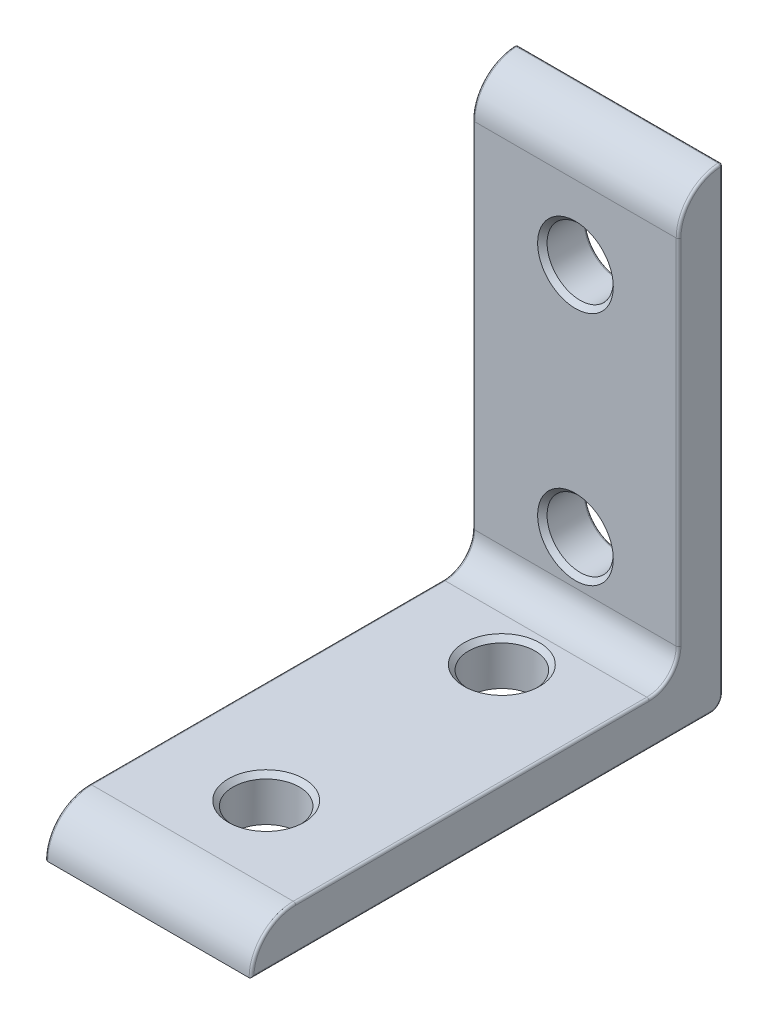
ISO-10303-21;
HEADER;
FILE_DESCRIPTION(('STEP AP214'),'2;1');
FILE_NAME('part.step','',(''),(''),'','','');
FILE_SCHEMA(('AUTOMOTIVE_DESIGN { 1 0 10303 214 1 1 1 1 }'));
ENDSEC;
DATA;
#1=APPLICATION_CONTEXT('core data for automotive mechanical design processes');
#2=APPLICATION_PROTOCOL_DEFINITION('international standard','automotive_design',2000,#1);
#3=PRODUCT_CONTEXT('',#1,'mechanical');
#4=PRODUCT('Part','Part','',(#3));
#5=PRODUCT_RELATED_PRODUCT_CATEGORY('part','',(#4));
#6=PRODUCT_DEFINITION_FORMATION('','',#4);
#7=PRODUCT_DEFINITION_CONTEXT('part definition',#1,'design');
#8=PRODUCT_DEFINITION('design','',#6,#7);
#9=PRODUCT_DEFINITION_SHAPE('','',#8);
#10=(LENGTH_UNIT() NAMED_UNIT(*) SI_UNIT(.MILLI.,.METRE.));
#11=(NAMED_UNIT(*) PLANE_ANGLE_UNIT() SI_UNIT($,.RADIAN.));
#12=(NAMED_UNIT(*) SI_UNIT($,.STERADIAN.) SOLID_ANGLE_UNIT());
#13=UNCERTAINTY_MEASURE_WITH_UNIT(LENGTH_MEASURE(1.E-05),#10,'distance_accuracy_value','');
#14=(GEOMETRIC_REPRESENTATION_CONTEXT(3) GLOBAL_UNCERTAINTY_ASSIGNED_CONTEXT((#13)) GLOBAL_UNIT_ASSIGNED_CONTEXT((#10,
#11,#12)) REPRESENTATION_CONTEXT('',''));
#15=CARTESIAN_POINT('',(0.,0.,0.));
#16=DIRECTION('',(0.,0.,1.));
#17=DIRECTION('',(1.,0.,0.));
#18=AXIS2_PLACEMENT_3D('',#15,#16,#17);
#19=CARTESIAN_POINT('',(-11.1125,-25.4,41.275));
#20=DIRECTION('',(1.,0.,0.));
#21=DIRECTION('',(0.,0.,-1.));
#22=AXIS2_PLACEMENT_3D('',#19,#20,#21);
#23=CYLINDRICAL_SURFACE('',#22,4.7625);
#24=DIRECTION('',(1.,0.,0.));
#25=VECTOR('',#24,1.);
#26=CARTESIAN_POINT('',(-11.1125,-20.6375,41.275));
#27=LINE('',#26,#25);
#28=CARTESIAN_POINT('',(-10.8585,-20.6375,41.275));
#29=VERTEX_POINT('',#28);
#30=CARTESIAN_POINT('',(10.8585,-20.6375,41.275));
#31=VERTEX_POINT('',#30);
#32=EDGE_CURVE('E230',#29,#31,#27,.T.);
#33=ORIENTED_EDGE('',*,*,#32,.F.);
#34=CARTESIAN_POINT('',(-10.8585,-25.4,41.275));
#35=DIRECTION('',(1.,0.,0.));
#36=DIRECTION('',(0.,0.,-1.));
#37=AXIS2_PLACEMENT_3D('',#34,#35,#36);
#38=CIRCLE('',#37,4.7625);
#39=CARTESIAN_POINT('',(-10.8585,-25.4,46.0375));
#40=VERTEX_POINT('',#39);
#41=EDGE_CURVE('E345',#29,#40,#38,.T.);
#42=ORIENTED_EDGE('',*,*,#41,.T.);
#43=DIRECTION('',(1.,0.,0.));
#44=VECTOR('',#43,1.);
#45=CARTESIAN_POINT('',(-11.1125,-25.4,46.0375));
#46=LINE('',#45,#44);
#47=CARTESIAN_POINT('',(10.8585,-25.4,46.0375));
#48=VERTEX_POINT('',#47);
#49=EDGE_CURVE('E220',#40,#48,#46,.T.);
#50=ORIENTED_EDGE('',*,*,#49,.T.);
#51=CARTESIAN_POINT('',(10.8585,-25.4,41.275));
#52=DIRECTION('',(1.,0.,0.));
#53=DIRECTION('',(0.,0.,-1.));
#54=AXIS2_PLACEMENT_3D('',#51,#52,#53);
#55=CIRCLE('',#54,4.7625);
#56=EDGE_CURVE('E342',#48,#31,#55,.F.);
#57=ORIENTED_EDGE('',*,*,#56,.T.);
#58=EDGE_LOOP('',(#33,#42,#50,#57));
#59=FACE_BOUND('',#58,.T.);
#60=ADVANCED_FACE('F47',(#59),#23,.T.);
#61=CARTESIAN_POINT('',(-11.1125,-20.6375,3.17499999999999));
#62=DIRECTION('',(0.,1.,0.));
#63=DIRECTION('',(0.,0.,1.));
#64=AXIS2_PLACEMENT_3D('',#61,#62,#63);
#65=PLANE('',#64);
#66=CARTESIAN_POINT('',(0.,-20.6375,33.3375));
#67=DIRECTION('',(0.,1.,0.));
#68=DIRECTION('',(0.,0.,1.));
#69=AXIS2_PLACEMENT_3D('',#66,#67,#68);
#70=CIRCLE('',#69,4.07670000000001);
#71=CARTESIAN_POINT('',(0.,-20.6375,37.4142));
#72=VERTEX_POINT('',#71);
#73=EDGE_CURVE('E276',#72,#72,#70,.F.);
#74=ORIENTED_EDGE('',*,*,#73,.T.);
#75=EDGE_LOOP('',(#74));
#76=FACE_BOUND('',#75,.T.);
#77=CARTESIAN_POINT('',(0.,-20.6375,7.9375));
#78=DIRECTION('',(0.,1.,0.));
#79=DIRECTION('',(0.,0.,1.));
#80=AXIS2_PLACEMENT_3D('',#77,#78,#79);
#81=CIRCLE('',#80,4.07670000000001);
#82=CARTESIAN_POINT('',(0.,-20.6375,12.0142));
#83=VERTEX_POINT('',#82);
#84=EDGE_CURVE('E272',#83,#83,#81,.F.);
#85=ORIENTED_EDGE('',*,*,#84,.T.);
#86=EDGE_LOOP('',(#85));
#87=FACE_BOUND('',#86,.T.);
#88=DIRECTION('',(1.,0.,0.));
#89=VECTOR('',#88,1.);
#90=CARTESIAN_POINT('',(-11.1125,-20.6375,3.17499999999999));
#91=LINE('',#90,#89);
#92=CARTESIAN_POINT('',(-10.8585,-20.6375,3.17499999999999));
#93=VERTEX_POINT('',#92);
#94=CARTESIAN_POINT('',(10.8585,-20.6375,3.17499999999999));
#95=VERTEX_POINT('',#94);
#96=EDGE_CURVE('E240',#93,#95,#91,.T.);
#97=ORIENTED_EDGE('',*,*,#96,.F.);
#98=DIRECTION('',(0.,0.,1.));
#99=VECTOR('',#98,1.);
#100=CARTESIAN_POINT('',(-10.8585,-20.6375,41.275));
#101=LINE('',#100,#99);
#102=EDGE_CURVE('E351',#93,#29,#101,.T.);
#103=ORIENTED_EDGE('',*,*,#102,.T.);
#104=ORIENTED_EDGE('',*,*,#32,.T.);
#105=DIRECTION('',(0.,0.,1.));
#106=VECTOR('',#105,1.);
#107=CARTESIAN_POINT('',(10.8585,-20.6375,3.17499999999999));
#108=LINE('',#107,#106);
#109=EDGE_CURVE('E348',#31,#95,#108,.F.);
#110=ORIENTED_EDGE('',*,*,#109,.T.);
#111=EDGE_LOOP('',(#97,#103,#104,#110));
#112=FACE_BOUND('',#111,.T.);
#113=ADVANCED_FACE('F636',(#76,#87,#112),#65,.T.);
#114=CARTESIAN_POINT('',(-11.1125,-17.4625,3.17499999999999));
#115=DIRECTION('',(1.,0.,0.));
#116=DIRECTION('',(0.,0.,-1.));
#117=AXIS2_PLACEMENT_3D('',#114,#115,#116);
#118=CYLINDRICAL_SURFACE('',#117,3.175);
#119=DIRECTION('',(1.,0.,0.));
#120=VECTOR('',#119,1.);
#121=CARTESIAN_POINT('',(-11.1125,-17.4625,0.));
#122=LINE('',#121,#120);
#123=CARTESIAN_POINT('',(-10.8585,-17.4625,0.));
#124=VERTEX_POINT('',#123);
#125=CARTESIAN_POINT('',(10.8585,-17.4625,0.));
#126=VERTEX_POINT('',#125);
#127=EDGE_CURVE('E606',#124,#126,#122,.T.);
#128=ORIENTED_EDGE('',*,*,#127,.F.);
#129=CARTESIAN_POINT('',(-10.8585,-17.4625,3.17499999999999));
#130=DIRECTION('',(1.,0.,0.));
#131=DIRECTION('',(0.,0.,-1.));
#132=AXIS2_PLACEMENT_3D('',#129,#130,#131);
#133=CIRCLE('',#132,3.175);
#134=EDGE_CURVE('E357',#124,#93,#133,.F.);
#135=ORIENTED_EDGE('',*,*,#134,.T.);
#136=ORIENTED_EDGE('',*,*,#96,.T.);
#137=CARTESIAN_POINT('',(10.8585,-17.4625,3.17499999999999));
#138=DIRECTION('',(1.,0.,0.));
#139=DIRECTION('',(0.,0.,-1.));
#140=AXIS2_PLACEMENT_3D('',#137,#138,#139);
#141=CIRCLE('',#140,3.175);
#142=EDGE_CURVE('E354',#95,#126,#141,.T.);
#143=ORIENTED_EDGE('',*,*,#142,.T.);
#144=EDGE_LOOP('',(#128,#135,#136,#143));
#145=FACE_BOUND('',#144,.T.);
#146=ADVANCED_FACE('F640',(#145),#118,.F.);
#147=CARTESIAN_POINT('',(-11.1125,20.6375,0.));
#148=DIRECTION('',(0.,0.,1.));
#149=DIRECTION('',(0.,-1.,0.));
#150=AXIS2_PLACEMENT_3D('',#147,#148,#149);
#151=PLANE('',#150);
#152=CARTESIAN_POINT('',(0.,12.7,0.));
#153=DIRECTION('',(0.,0.,1.));
#154=DIRECTION('',(0.,-1.,0.));
#155=AXIS2_PLACEMENT_3D('',#152,#153,#154);
#156=CIRCLE('',#155,4.0767);
#157=CARTESIAN_POINT('',(0.,8.6233,0.));
#158=VERTEX_POINT('',#157);
#159=EDGE_CURVE('E260',#158,#158,#156,.F.);
#160=ORIENTED_EDGE('',*,*,#159,.T.);
#161=EDGE_LOOP('',(#160));
#162=FACE_BOUND('',#161,.T.);
#163=CARTESIAN_POINT('',(0.,-12.7,0.));
#164=DIRECTION('',(0.,0.,1.));
#165=DIRECTION('',(0.,-1.,0.));
#166=AXIS2_PLACEMENT_3D('',#163,#164,#165);
#167=CIRCLE('',#166,4.07670000000001);
#168=CARTESIAN_POINT('',(0.,-16.7767,0.));
#169=VERTEX_POINT('',#168);
#170=EDGE_CURVE('E256',#169,#169,#167,.F.);
#171=ORIENTED_EDGE('',*,*,#170,.T.);
#172=EDGE_LOOP('',(#171));
#173=FACE_BOUND('',#172,.T.);
#174=DIRECTION('',(1.,0.,0.));
#175=VECTOR('',#174,1.);
#176=CARTESIAN_POINT('',(-11.1125,20.6375,0.));
#177=LINE('',#176,#175);
#178=CARTESIAN_POINT('',(-10.8585,20.6375,0.));
#179=VERTEX_POINT('',#178);
#180=CARTESIAN_POINT('',(10.8585,20.6375,0.));
#181=VERTEX_POINT('',#180);
#182=EDGE_CURVE('E611',#179,#181,#177,.T.);
#183=ORIENTED_EDGE('',*,*,#182,.F.);
#184=DIRECTION('',(0.,-1.,0.));
#185=VECTOR('',#184,1.);
#186=CARTESIAN_POINT('',(-10.8585,-17.4625,0.));
#187=LINE('',#186,#185);
#188=EDGE_CURVE('E11',#179,#124,#187,.T.);
#189=ORIENTED_EDGE('',*,*,#188,.T.);
#190=ORIENTED_EDGE('',*,*,#127,.T.);
#191=DIRECTION('',(0.,-1.,0.));
#192=VECTOR('',#191,1.);
#193=CARTESIAN_POINT('',(10.8585,20.6375,0.));
#194=LINE('',#193,#192);
#195=EDGE_CURVE('E57',#126,#181,#194,.F.);
#196=ORIENTED_EDGE('',*,*,#195,.T.);
#197=EDGE_LOOP('',(#183,#189,#190,#196));
#198=FACE_BOUND('',#197,.T.);
#199=ADVANCED_FACE('F670',(#162,#173,#198),#151,.T.);
#200=CARTESIAN_POINT('',(-11.1125,20.6375,-4.7625));
#201=DIRECTION('',(1.,0.,0.));
#202=DIRECTION('',(0.,0.,-1.));
#203=AXIS2_PLACEMENT_3D('',#200,#201,#202);
#204=CYLINDRICAL_SURFACE('',#203,4.7625);
#205=DIRECTION('',(1.,0.,0.));
#206=VECTOR('',#205,1.);
#207=CARTESIAN_POINT('',(-11.1125,25.39243596902,-4.49419014084507));
#208=LINE('',#207,#206);
#209=CARTESIAN_POINT('',(10.8585,25.39243596902,-4.49419014084507));
#210=VERTEX_POINT('',#209);
#211=CARTESIAN_POINT('',(-10.8585,25.39243596902,-4.49419014084507));
#212=VERTEX_POINT('',#211);
#213=EDGE_CURVE('E333',#210,#212,#208,.F.);
#214=ORIENTED_EDGE('',*,*,#213,.T.);
#215=CARTESIAN_POINT('',(-10.8585,20.6375,-4.7625));
#216=DIRECTION('',(1.,0.,0.));
#217=DIRECTION('',(0.,0.,-1.));
#218=AXIS2_PLACEMENT_3D('',#215,#216,#217);
#219=CIRCLE('',#218,4.7625);
#220=EDGE_CURVE('E339',#212,#179,#219,.T.);
#221=ORIENTED_EDGE('',*,*,#220,.T.);
#222=ORIENTED_EDGE('',*,*,#182,.T.);
#223=CARTESIAN_POINT('',(10.8585,20.6375,-4.7625));
#224=DIRECTION('',(1.,0.,0.));
#225=DIRECTION('',(0.,0.,-1.));
#226=AXIS2_PLACEMENT_3D('',#223,#224,#225);
#227=CIRCLE('',#226,4.7625);
#228=EDGE_CURVE('E336',#181,#210,#227,.F.);
#229=ORIENTED_EDGE('',*,*,#228,.T.);
#230=EDGE_LOOP('',(#214,#221,#222,#229));
#231=FACE_BOUND('',#230,.T.);
#232=ADVANCED_FACE('F660',(#231),#204,.T.);
#233=CARTESIAN_POINT('',(-11.1125,-25.4,-4.7625));
#234=DIRECTION('',(0.,0.,-1.));
#235=DIRECTION('',(0.,1.,0.));
#236=AXIS2_PLACEMENT_3D('',#233,#234,#235);
#237=PLANE('',#236);
#238=CARTESIAN_POINT('',(0.,-12.7,-4.7625));
#239=DIRECTION('',(0.,0.,-1.));
#240=DIRECTION('',(0.,1.,0.));
#241=AXIS2_PLACEMENT_3D('',#238,#239,#240);
#242=CIRCLE('',#241,3.8227);
#243=CARTESIAN_POINT('',(0.,-8.8773,-4.7625));
#244=VERTEX_POINT('',#243);
#245=EDGE_CURVE('E364',#244,#244,#242,.F.);
#246=ORIENTED_EDGE('',*,*,#245,.T.);
#247=EDGE_LOOP('',(#246));
#248=FACE_BOUND('',#247,.T.);
#249=CARTESIAN_POINT('',(0.,12.7,-4.7625));
#250=DIRECTION('',(0.,0.,-1.));
#251=DIRECTION('',(0.,1.,0.));
#252=AXIS2_PLACEMENT_3D('',#249,#250,#251);
#253=CIRCLE('',#252,3.8227);
#254=CARTESIAN_POINT('',(0.,16.5227,-4.7625));
#255=VERTEX_POINT('',#254);
#256=EDGE_CURVE('E360',#255,#255,#253,.F.);
#257=ORIENTED_EDGE('',*,*,#256,.T.);
#258=EDGE_LOOP('',(#257));
#259=FACE_BOUND('',#258,.T.);
#260=DIRECTION('',(1.,0.,0.));
#261=VECTOR('',#260,1.);
#262=CARTESIAN_POINT('',(-11.1125,-24.1284125,-4.7625));
#263=LINE('',#262,#261);
#264=CARTESIAN_POINT('',(10.8585,-24.1284125,-4.7625));
#265=VERTEX_POINT('',#264);
#266=CARTESIAN_POINT('',(-10.8585,-24.1284125,-4.7625));
#267=VERTEX_POINT('',#266);
#268=EDGE_CURVE('E229',#265,#267,#263,.F.);
#269=ORIENTED_EDGE('',*,*,#268,.T.);
#270=DIRECTION('',(0.,1.,0.));
#271=VECTOR('',#270,1.);
#272=CARTESIAN_POINT('',(-10.8585,25.4,-4.7625));
#273=LINE('',#272,#271);
#274=CARTESIAN_POINT('',(-10.8585,25.1388393840056,-4.7625));
#275=VERTEX_POINT('',#274);
#276=EDGE_CURVE('E68',#267,#275,#273,.T.);
#277=ORIENTED_EDGE('',*,*,#276,.T.);
#278=DIRECTION('',(1.,0.,0.));
#279=VECTOR('',#278,1.);
#280=CARTESIAN_POINT('',(-11.1125,25.1388393840056,-4.7625));
#281=LINE('',#280,#279);
#282=CARTESIAN_POINT('',(10.8585,25.1388393840056,-4.7625));
#283=VERTEX_POINT('',#282);
#284=EDGE_CURVE('E72',#275,#283,#281,.T.);
#285=ORIENTED_EDGE('',*,*,#284,.T.);
#286=DIRECTION('',(0.,1.,0.));
#287=VECTOR('',#286,1.);
#288=CARTESIAN_POINT('',(10.8585,-25.4,-4.7625));
#289=LINE('',#288,#287);
#290=EDGE_CURVE('E368',#283,#265,#289,.F.);
#291=ORIENTED_EDGE('',*,*,#290,.T.);
#292=EDGE_LOOP('',(#269,#277,#285,#291));
#293=FACE_BOUND('',#292,.T.);
#294=ADVANCED_FACE('F658',(#248,#259,#293),#237,.T.);
#295=CARTESIAN_POINT('',(-11.1125,-25.4,46.0375));
#296=DIRECTION('',(0.,-1.,0.));
#297=DIRECTION('',(0.,0.,-1.));
#298=AXIS2_PLACEMENT_3D('',#295,#296,#297);
#299=PLANE('',#298);
#300=CARTESIAN_POINT('',(0.,-25.4,7.9375));
#301=DIRECTION('',(0.,-1.,0.));
#302=DIRECTION('',(0.,0.,-1.));
#303=AXIS2_PLACEMENT_3D('',#300,#301,#302);
#304=CIRCLE('',#303,3.5687);
#305=CARTESIAN_POINT('',(0.,-25.4,4.3688));
#306=VERTEX_POINT('',#305);
#307=EDGE_CURVE('E249',#306,#306,#304,.T.);
#308=ORIENTED_EDGE('',*,*,#307,.F.);
#309=EDGE_LOOP('',(#308));
#310=FACE_BOUND('',#309,.T.);
#311=CARTESIAN_POINT('',(0.,-25.4,33.3375));
#312=DIRECTION('',(0.,-1.,0.));
#313=DIRECTION('',(0.,0.,-1.));
#314=AXIS2_PLACEMENT_3D('',#311,#312,#313);
#315=CIRCLE('',#314,3.5687);
#316=CARTESIAN_POINT('',(0.,-25.4,29.7688));
#317=VERTEX_POINT('',#316);
#318=EDGE_CURVE('E245',#317,#317,#315,.T.);
#319=ORIENTED_EDGE('',*,*,#318,.F.);
#320=EDGE_LOOP('',(#319));
#321=FACE_BOUND('',#320,.T.);
#322=ORIENTED_EDGE('',*,*,#49,.F.);
#323=DIRECTION('',(0.,0.,-1.));
#324=VECTOR('',#323,1.);
#325=CARTESIAN_POINT('',(-10.8585,-25.4,-3.4909125));
#326=LINE('',#325,#324);
#327=CARTESIAN_POINT('',(-10.8585,-25.4,-3.4909125));
#328=VERTEX_POINT('',#327);
#329=EDGE_CURVE('E193',#40,#328,#326,.T.);
#330=ORIENTED_EDGE('',*,*,#329,.T.);
#331=DIRECTION('',(1.,0.,0.));
#332=VECTOR('',#331,1.);
#333=CARTESIAN_POINT('',(-11.1125,-25.4,-3.4909125));
#334=LINE('',#333,#332);
#335=CARTESIAN_POINT('',(10.8585,-25.4,-3.4909125));
#336=VERTEX_POINT('',#335);
#337=EDGE_CURVE('E217',#328,#336,#334,.T.);
#338=ORIENTED_EDGE('',*,*,#337,.T.);
#339=DIRECTION('',(0.,0.,-1.));
#340=VECTOR('',#339,1.);
#341=CARTESIAN_POINT('',(10.8585,-25.4,46.0375));
#342=LINE('',#341,#340);
#343=EDGE_CURVE('E224',#336,#48,#342,.F.);
#344=ORIENTED_EDGE('',*,*,#343,.T.);
#345=EDGE_LOOP('',(#322,#330,#338,#344));
#346=FACE_BOUND('',#345,.T.);
#347=ADVANCED_FACE('F216',(#310,#321,#346),#299,.T.);
#348=CARTESIAN_POINT('',(-11.1125,-25.4,41.275));
#349=DIRECTION('',(1.,0.,0.));
#350=DIRECTION('',(0.,0.,-1.));
#351=AXIS2_PLACEMENT_3D('',#348,#349,#350);
#352=PLANE('',#351);
#353=DIRECTION('',(0.,1.,0.));
#354=VECTOR('',#353,1.);
#355=CARTESIAN_POINT('',(-11.1125,-24.1284125,-4.5085));
#356=LINE('',#355,#354);
#357=CARTESIAN_POINT('',(-11.1125,25.1388393840056,-4.5085));
#358=VERTEX_POINT('',#357);
#359=CARTESIAN_POINT('',(-11.1125,-24.1284125,-4.5085));
#360=VERTEX_POINT('',#359);
#361=EDGE_CURVE('E302',#358,#360,#356,.F.);
#362=ORIENTED_EDGE('',*,*,#361,.T.);
#363=CARTESIAN_POINT('',(-11.1125,-24.1284125,-3.4909125));
#364=DIRECTION('',(1.,0.,0.));
#365=DIRECTION('',(0.,0.,-1.));
#366=AXIS2_PLACEMENT_3D('',#363,#364,#365);
#367=CIRCLE('',#366,1.0175875);
#368=CARTESIAN_POINT('',(-11.1125,-25.146,-3.4909125));
#369=VERTEX_POINT('',#368);
#370=EDGE_CURVE('E305',#360,#369,#367,.F.);
#371=ORIENTED_EDGE('',*,*,#370,.T.);
#372=DIRECTION('',(0.,0.,-1.));
#373=VECTOR('',#372,1.);
#374=CARTESIAN_POINT('',(-11.1125,-25.146,46.0375));
#375=LINE('',#374,#373);
#376=CARTESIAN_POINT('',(-11.1125,-25.146,45.7763393840056));
#377=VERTEX_POINT('',#376);
#378=EDGE_CURVE('E195',#369,#377,#375,.F.);
#379=ORIENTED_EDGE('',*,*,#378,.T.);
#380=CARTESIAN_POINT('',(-11.1125,-25.4,41.275));
#381=DIRECTION('',(1.,0.,0.));
#382=DIRECTION('',(0.,0.,-1.));
#383=AXIS2_PLACEMENT_3D('',#380,#381,#382);
#384=CIRCLE('',#383,4.5085);
#385=CARTESIAN_POINT('',(-11.1125,-20.8915,41.275));
#386=VERTEX_POINT('',#385);
#387=EDGE_CURVE('E294',#377,#386,#384,.F.);
#388=ORIENTED_EDGE('',*,*,#387,.T.);
#389=DIRECTION('',(0.,0.,1.));
#390=VECTOR('',#389,1.);
#391=CARTESIAN_POINT('',(-11.1125,-20.8915,3.17499999999999));
#392=LINE('',#391,#390);
#393=CARTESIAN_POINT('',(-11.1125,-20.8915,3.17499999999999));
#394=VERTEX_POINT('',#393);
#395=EDGE_CURVE('E291',#386,#394,#392,.F.);
#396=ORIENTED_EDGE('',*,*,#395,.T.);
#397=CARTESIAN_POINT('',(-11.1125,-17.4625,3.17499999999999));
#398=DIRECTION('',(1.,0.,0.));
#399=DIRECTION('',(0.,0.,-1.));
#400=AXIS2_PLACEMENT_3D('',#397,#398,#399);
#401=CIRCLE('',#400,3.429);
#402=CARTESIAN_POINT('',(-11.1125,-17.4625,-0.254000000000005));
#403=VERTEX_POINT('',#402);
#404=EDGE_CURVE('E288',#394,#403,#401,.T.);
#405=ORIENTED_EDGE('',*,*,#404,.T.);
#406=DIRECTION('',(0.,-1.,0.));
#407=VECTOR('',#406,1.);
#408=CARTESIAN_POINT('',(-11.1125,20.6375,-0.254000000000002));
#409=LINE('',#408,#407);
#410=CARTESIAN_POINT('',(-11.1125,20.6375,-0.254000000000002));
#411=VERTEX_POINT('',#410);
#412=EDGE_CURVE('E223',#403,#411,#409,.F.);
#413=ORIENTED_EDGE('',*,*,#412,.T.);
#414=CARTESIAN_POINT('',(-11.1125,20.6375,-4.7625));
#415=DIRECTION('',(1.,0.,0.));
#416=DIRECTION('',(0.,0.,-1.));
#417=AXIS2_PLACEMENT_3D('',#414,#415,#416);
#418=CIRCLE('',#417,4.5085);
#419=EDGE_CURVE('E297',#411,#358,#418,.F.);
#420=ORIENTED_EDGE('',*,*,#419,.T.);
#421=EDGE_LOOP('',(#362,#371,#379,#388,#396,#405,#413,#420));
#422=FACE_BOUND('',#421,.T.);
#423=ADVANCED_FACE('F647',(#422),#352,.F.);
#424=CARTESIAN_POINT('',(11.1125,-25.4,41.275));
#425=DIRECTION('',(1.,0.,0.));
#426=DIRECTION('',(0.,0.,-1.));
#427=AXIS2_PLACEMENT_3D('',#424,#425,#426);
#428=PLANE('',#427);
#429=DIRECTION('',(0.,0.,-1.));
#430=VECTOR('',#429,1.);
#431=CARTESIAN_POINT('',(11.1125,-25.146,41.275));
#432=LINE('',#431,#430);
#433=CARTESIAN_POINT('',(11.1125,-25.146,45.7763393840056));
#434=VERTEX_POINT('',#433);
#435=CARTESIAN_POINT('',(11.1125,-25.146,-3.4909125));
#436=VERTEX_POINT('',#435);
#437=EDGE_CURVE('E324',#434,#436,#432,.T.);
#438=ORIENTED_EDGE('',*,*,#437,.T.);
#439=CARTESIAN_POINT('',(11.1125,-24.1284125,-3.4909125));
#440=DIRECTION('',(1.,0.,0.));
#441=DIRECTION('',(0.,0.,-1.));
#442=AXIS2_PLACEMENT_3D('',#439,#440,#441);
#443=CIRCLE('',#442,1.0175875);
#444=CARTESIAN_POINT('',(11.1125,-24.1284125,-4.5085));
#445=VERTEX_POINT('',#444);
#446=EDGE_CURVE('E330',#436,#445,#443,.T.);
#447=ORIENTED_EDGE('',*,*,#446,.T.);
#448=DIRECTION('',(0.,1.,0.));
#449=VECTOR('',#448,1.);
#450=CARTESIAN_POINT('',(11.1125,-25.4,-4.5085));
#451=LINE('',#450,#449);
#452=CARTESIAN_POINT('',(11.1125,25.1388393840056,-4.5085));
#453=VERTEX_POINT('',#452);
#454=EDGE_CURVE('E327',#445,#453,#451,.T.);
#455=ORIENTED_EDGE('',*,*,#454,.T.);
#456=CARTESIAN_POINT('',(11.1125,20.6375,-4.7625));
#457=DIRECTION('',(1.,0.,0.));
#458=DIRECTION('',(0.,0.,-1.));
#459=AXIS2_PLACEMENT_3D('',#456,#457,#458);
#460=CIRCLE('',#459,4.5085);
#461=CARTESIAN_POINT('',(11.1125,20.6375,-0.254000000000007));
#462=VERTEX_POINT('',#461);
#463=EDGE_CURVE('E321',#453,#462,#460,.T.);
#464=ORIENTED_EDGE('',*,*,#463,.T.);
#465=DIRECTION('',(0.,-1.,0.));
#466=VECTOR('',#465,1.);
#467=CARTESIAN_POINT('',(11.1125,-25.4,-0.254000000000011));
#468=LINE('',#467,#466);
#469=CARTESIAN_POINT('',(11.1125,-17.4625,-0.25400000000001));
#470=VERTEX_POINT('',#469);
#471=EDGE_CURVE('E210',#462,#470,#468,.T.);
#472=ORIENTED_EDGE('',*,*,#471,.T.);
#473=CARTESIAN_POINT('',(11.1125,-17.4625,3.17499999999999));
#474=DIRECTION('',(1.,0.,0.));
#475=DIRECTION('',(0.,0.,-1.));
#476=AXIS2_PLACEMENT_3D('',#473,#474,#475);
#477=CIRCLE('',#476,3.429);
#478=CARTESIAN_POINT('',(11.1125,-20.8915,3.17499999999999));
#479=VERTEX_POINT('',#478);
#480=EDGE_CURVE('E312',#470,#479,#477,.F.);
#481=ORIENTED_EDGE('',*,*,#480,.T.);
#482=DIRECTION('',(0.,0.,1.));
#483=VECTOR('',#482,1.);
#484=CARTESIAN_POINT('',(11.1125,-20.8915,41.275));
#485=LINE('',#484,#483);
#486=CARTESIAN_POINT('',(11.1125,-20.8915,41.275));
#487=VERTEX_POINT('',#486);
#488=EDGE_CURVE('E315',#479,#487,#485,.T.);
#489=ORIENTED_EDGE('',*,*,#488,.T.);
#490=CARTESIAN_POINT('',(11.1125,-25.4,41.275));
#491=DIRECTION('',(1.,0.,0.));
#492=DIRECTION('',(0.,0.,-1.));
#493=AXIS2_PLACEMENT_3D('',#490,#491,#492);
#494=CIRCLE('',#493,4.5085);
#495=EDGE_CURVE('E318',#487,#434,#494,.T.);
#496=ORIENTED_EDGE('',*,*,#495,.T.);
#497=EDGE_LOOP('',(#438,#447,#455,#464,#472,#481,#489,#496));
#498=FACE_BOUND('',#497,.T.);
#499=ADVANCED_FACE('F628',(#498),#428,.T.);
#500=CARTESIAN_POINT('',(-11.1125,-24.1284125,-3.4909125));
#501=DIRECTION('',(1.,0.,0.));
#502=DIRECTION('',(0.,0.,-1.));
#503=AXIS2_PLACEMENT_3D('',#500,#501,#502);
#504=CYLINDRICAL_SURFACE('',#503,1.2715875);
#505=ORIENTED_EDGE('',*,*,#337,.F.);
#506=CARTESIAN_POINT('',(-10.8585,-24.1284125,-3.4909125));
#507=DIRECTION('',(1.,0.,0.));
#508=DIRECTION('',(0.,0.,-1.));
#509=AXIS2_PLACEMENT_3D('',#506,#507,#508);
#510=CIRCLE('',#509,1.2715875);
#511=EDGE_CURVE('E202',#328,#267,#510,.T.);
#512=ORIENTED_EDGE('',*,*,#511,.T.);
#513=ORIENTED_EDGE('',*,*,#268,.F.);
#514=CARTESIAN_POINT('',(10.8585,-24.1284125,-3.4909125));
#515=DIRECTION('',(1.,0.,0.));
#516=DIRECTION('',(0.,0.,-1.));
#517=AXIS2_PLACEMENT_3D('',#514,#515,#516);
#518=CIRCLE('',#517,1.2715875);
#519=EDGE_CURVE('E211',#265,#336,#518,.F.);
#520=ORIENTED_EDGE('',*,*,#519,.T.);
#521=EDGE_LOOP('',(#505,#512,#513,#520));
#522=FACE_BOUND('',#521,.T.);
#523=ADVANCED_FACE('F226',(#522),#504,.T.);
#524=CARTESIAN_POINT('',(0.,-12.7,-4.7625));
#525=DIRECTION('',(0.,0.,1.));
#526=DIRECTION('',(1.,0.,0.));
#527=AXIS2_PLACEMENT_3D('',#524,#525,#526);
#528=CYLINDRICAL_SURFACE('',#527,3.5687);
#529=CARTESIAN_POINT('',(0.,-12.7,-4.5085));
#530=DIRECTION('',(0.,0.,-1.));
#531=DIRECTION('',(0.,1.,0.));
#532=AXIS2_PLACEMENT_3D('',#529,#530,#531);
#533=CIRCLE('',#532,3.5687);
#534=CARTESIAN_POINT('',(0.,-9.1313,-4.5085));
#535=VERTEX_POINT('',#534);
#536=EDGE_CURVE('E375',#535,#535,#533,.T.);
#537=ORIENTED_EDGE('',*,*,#536,.T.);
#538=EDGE_LOOP('',(#537));
#539=FACE_BOUND('',#538,.T.);
#540=CARTESIAN_POINT('',(0.,-12.7,-0.508000000000005));
#541=DIRECTION('',(0.,0.,1.));
#542=DIRECTION('',(1.,0.,0.));
#543=AXIS2_PLACEMENT_3D('',#540,#541,#542);
#544=CIRCLE('',#543,3.5687);
#545=CARTESIAN_POINT('',(3.5687,-12.7,-0.508000000000005));
#546=VERTEX_POINT('',#545);
#547=EDGE_CURVE('E264',#546,#546,#544,.T.);
#548=ORIENTED_EDGE('',*,*,#547,.T.);
#549=EDGE_LOOP('',(#548));
#550=FACE_BOUND('',#549,.T.);
#551=ADVANCED_FACE('F686',(#539,#550),#528,.F.);
#552=CARTESIAN_POINT('',(0.,12.7,-4.7625));
#553=DIRECTION('',(0.,0.,1.));
#554=DIRECTION('',(1.,0.,0.));
#555=AXIS2_PLACEMENT_3D('',#552,#553,#554);
#556=CYLINDRICAL_SURFACE('',#555,3.5687);
#557=CARTESIAN_POINT('',(0.,12.7,-4.5085));
#558=DIRECTION('',(0.,0.,-1.));
#559=DIRECTION('',(0.,1.,0.));
#560=AXIS2_PLACEMENT_3D('',#557,#558,#559);
#561=CIRCLE('',#560,3.5687);
#562=CARTESIAN_POINT('',(0.,16.2687,-4.5085));
#563=VERTEX_POINT('',#562);
#564=EDGE_CURVE('E379',#563,#563,#561,.T.);
#565=ORIENTED_EDGE('',*,*,#564,.T.);
#566=EDGE_LOOP('',(#565));
#567=FACE_BOUND('',#566,.T.);
#568=CARTESIAN_POINT('',(0.,12.7,-0.508000000000002));
#569=DIRECTION('',(0.,0.,1.));
#570=DIRECTION('',(1.,0.,0.));
#571=AXIS2_PLACEMENT_3D('',#568,#569,#570);
#572=CIRCLE('',#571,3.5687);
#573=CARTESIAN_POINT('',(3.5687,12.7,-0.508000000000002));
#574=VERTEX_POINT('',#573);
#575=EDGE_CURVE('E236',#574,#574,#572,.T.);
#576=ORIENTED_EDGE('',*,*,#575,.T.);
#577=EDGE_LOOP('',(#576));
#578=FACE_BOUND('',#577,.T.);
#579=ADVANCED_FACE('F715',(#567,#578),#556,.F.);
#580=CARTESIAN_POINT('',(0.,-28.5115,33.3375));
#581=DIRECTION('',(0.,1.,0.));
#582=DIRECTION('',(0.,0.,1.));
#583=AXIS2_PLACEMENT_3D('',#580,#581,#582);
#584=CYLINDRICAL_SURFACE('',#583,3.5687);
#585=CARTESIAN_POINT('',(0.,-21.1455,33.3375));
#586=DIRECTION('',(0.,1.,0.));
#587=DIRECTION('',(0.,0.,1.));
#588=AXIS2_PLACEMENT_3D('',#585,#586,#587);
#589=CIRCLE('',#588,3.5687);
#590=CARTESIAN_POINT('',(0.,-21.1455,36.9062));
#591=VERTEX_POINT('',#590);
#592=EDGE_CURVE('E268',#591,#591,#589,.T.);
#593=ORIENTED_EDGE('',*,*,#592,.T.);
#594=EDGE_LOOP('',(#593));
#595=FACE_BOUND('',#594,.T.);
#596=ORIENTED_EDGE('',*,*,#318,.T.);
#597=EDGE_LOOP('',(#596));
#598=FACE_BOUND('',#597,.T.);
#599=ADVANCED_FACE('F708',(#595,#598),#584,.F.);
#600=CARTESIAN_POINT('',(0.,-28.5115,7.9375));
#601=DIRECTION('',(0.,1.,0.));
#602=DIRECTION('',(0.,0.,1.));
#603=AXIS2_PLACEMENT_3D('',#600,#601,#602);
#604=CYLINDRICAL_SURFACE('',#603,3.5687);
#605=CARTESIAN_POINT('',(0.,-21.1455,7.9375));
#606=DIRECTION('',(0.,1.,0.));
#607=DIRECTION('',(0.,0.,1.));
#608=AXIS2_PLACEMENT_3D('',#605,#606,#607);
#609=CIRCLE('',#608,3.5687);
#610=CARTESIAN_POINT('',(0.,-21.1455,11.5062));
#611=VERTEX_POINT('',#610);
#612=EDGE_CURVE('E280',#611,#611,#609,.T.);
#613=ORIENTED_EDGE('',*,*,#612,.T.);
#614=EDGE_LOOP('',(#613));
#615=FACE_BOUND('',#614,.T.);
#616=ORIENTED_EDGE('',*,*,#307,.T.);
#617=EDGE_LOOP('',(#616));
#618=FACE_BOUND('',#617,.T.);
#619=ADVANCED_FACE('F691',(#615,#618),#604,.F.);
#620=CARTESIAN_POINT('',(0.,12.7,-0.508000000000002));
#621=DIRECTION('',(0.,0.,1.));
#622=DIRECTION('',(1.,0.,0.));
#623=AXIS2_PLACEMENT_3D('',#620,#621,#622);
#624=CONICAL_SURFACE('',#623,3.5687,0.78539816339745);
#625=ORIENTED_EDGE('',*,*,#159,.F.);
#626=EDGE_LOOP('',(#625));
#627=FACE_BOUND('',#626,.T.);
#628=ORIENTED_EDGE('',*,*,#575,.F.);
#629=EDGE_LOOP('',(#628));
#630=FACE_BOUND('',#629,.T.);
#631=ADVANCED_FACE('F687',(#627,#630),#624,.F.);
#632=CARTESIAN_POINT('',(0.,-12.7,-0.508000000000005));
#633=DIRECTION('',(0.,0.,1.));
#634=DIRECTION('',(1.,0.,0.));
#635=AXIS2_PLACEMENT_3D('',#632,#633,#634);
#636=CONICAL_SURFACE('',#635,3.5687,0.785398163397455);
#637=ORIENTED_EDGE('',*,*,#170,.F.);
#638=EDGE_LOOP('',(#637));
#639=FACE_BOUND('',#638,.T.);
#640=ORIENTED_EDGE('',*,*,#547,.F.);
#641=EDGE_LOOP('',(#640));
#642=FACE_BOUND('',#641,.T.);
#643=ADVANCED_FACE('F690',(#639,#642),#636,.F.);
#644=CARTESIAN_POINT('',(0.,-21.1455,33.3375));
#645=DIRECTION('',(0.,1.,0.));
#646=DIRECTION('',(0.,0.,1.));
#647=AXIS2_PLACEMENT_3D('',#644,#645,#646);
#648=CONICAL_SURFACE('',#647,3.5687,0.785398163397456);
#649=ORIENTED_EDGE('',*,*,#73,.F.);
#650=EDGE_LOOP('',(#649));
#651=FACE_BOUND('',#650,.T.);
#652=ORIENTED_EDGE('',*,*,#592,.F.);
#653=EDGE_LOOP('',(#652));
#654=FACE_BOUND('',#653,.T.);
#655=ADVANCED_FACE('F695',(#651,#654),#648,.F.);
#656=CARTESIAN_POINT('',(0.,-21.1455,7.9375));
#657=DIRECTION('',(0.,1.,0.));
#658=DIRECTION('',(0.,0.,1.));
#659=AXIS2_PLACEMENT_3D('',#656,#657,#658);
#660=CONICAL_SURFACE('',#659,3.5687,0.785398163397455);
#661=ORIENTED_EDGE('',*,*,#84,.F.);
#662=EDGE_LOOP('',(#661));
#663=FACE_BOUND('',#662,.T.);
#664=ORIENTED_EDGE('',*,*,#612,.F.);
#665=EDGE_LOOP('',(#664));
#666=FACE_BOUND('',#665,.T.);
#667=ADVANCED_FACE('F461',(#663,#666),#660,.F.);
#668=CARTESIAN_POINT('',(10.8585,-25.4,41.275));
#669=DIRECTION('',(1.,0.,0.));
#670=DIRECTION('',(0.,0.,-1.));
#671=AXIS2_PLACEMENT_3D('',#668,#669,#670);
#672=TOROIDAL_SURFACE('',#671,4.5085,0.254);
#673=CARTESIAN_POINT('',(10.8585,-25.4,46.0375));
#674=CARTESIAN_POINT('',(10.8698762313463,-25.4000192330531,46.037518605478));
#675=CARTESIAN_POINT('',(10.8812243433398,-25.3992370610143,46.0367370790178));
#676=CARTESIAN_POINT('',(10.9034379318322,-25.3962367440464,46.0337356496582));
#677=CARTESIAN_POINT('',(10.9143067021098,-25.394030917903,46.0315280860215));
#678=CARTESIAN_POINT('',(10.9353128643374,-25.3883526527001,46.0258391638067));
#679=CARTESIAN_POINT('',(10.9454521161424,-25.3848835819147,46.0223611925263));
#680=CARTESIAN_POINT('',(10.964871473307,-25.3768929506727,46.0143383362931));
#681=CARTESIAN_POINT('',(10.9741496290527,-25.3723690795751,46.0097911088435));
#682=CARTESIAN_POINT('',(10.9952782301381,-25.3604944400431,45.9978343217826));
#683=CARTESIAN_POINT('',(11.0066649199503,-25.3527380743674,45.9900086999704));
#684=CARTESIAN_POINT('',(11.0275236819516,-25.336068419049,45.9731410758718));
#685=CARTESIAN_POINT('',(11.0369920821123,-25.3271529631965,45.9640967948654));
#686=CARTESIAN_POINT('',(11.0575007321147,-25.3048300846396,45.9413783755965));
#687=CARTESIAN_POINT('',(11.0676711632514,-25.2910451765997,45.9272923043152));
#688=CARTESIAN_POINT('',(11.0847636788642,-25.2626043972422,45.8980863612544));
#689=CARTESIAN_POINT('',(11.0916814424291,-25.2479473963551,45.8829651447244));
#690=CARTESIAN_POINT('',(11.1021954092487,-25.2191339518849,45.8530854528278));
#691=CARTESIAN_POINT('',(11.1059728327848,-25.2050038283809,45.8383637758988));
#692=CARTESIAN_POINT('',(11.1110568087286,-25.1766307570436,45.8086557279928));
#693=CARTESIAN_POINT('',(11.1123681555787,-25.1623880823056,45.7936699279168));
#694=CARTESIAN_POINT('',(11.1124968444756,-25.1474608820799,45.7778848262677));
#695=CARTESIAN_POINT('',(11.1124999941532,-25.1467303720682,45.7771121323185));
#696=CARTESIAN_POINT('',(11.1125,-25.146,45.7763393840056));
#697=B_SPLINE_CURVE_WITH_KNOTS('',3,(#673,#674,#675,#676,#677,#678,#679,#680,#681,#682,#683,
#684,#685,#686,#687,#688,#689,#690,#691,#692,#693,#694,#695,#696),.UNSPECIFIED.,.F.,.F.,(4,2,2,
2,2,2,2,2,2,2,2,4),(0.,0.0340304929860746,0.0677704000257823,0.10142099504131,0.135146009207402,
0.18241763085485,0.229778903168415,0.295954845535662,0.36221845074715,0.424323163959806,
0.486307010478045,0.489497034274662),.UNSPECIFIED.);
#698=EDGE_CURVE('E465',#434,#48,#697,.F.);
#699=ORIENTED_EDGE('',*,*,#698,.F.);
#700=ORIENTED_EDGE('',*,*,#495,.F.);
#701=CARTESIAN_POINT('',(10.8585,-20.8915,41.275));
#702=DIRECTION('',(0.,0.,-1.));
#703=DIRECTION('',(-1.,0.,0.));
#704=AXIS2_PLACEMENT_3D('',#701,#702,#703);
#705=CIRCLE('',#704,0.254);
#706=EDGE_CURVE('E51',#31,#487,#705,.T.);
#707=ORIENTED_EDGE('',*,*,#706,.F.);
#708=ORIENTED_EDGE('',*,*,#56,.F.);
#709=EDGE_LOOP('',(#699,#700,#707,#708));
#710=FACE_BOUND('',#709,.T.);
#711=ADVANCED_FACE('F456',(#710),#672,.T.);
#712=CARTESIAN_POINT('',(10.8585,-20.8915,41.275));
#713=DIRECTION('',(0.,0.,1.));
#714=DIRECTION('',(0.,-1.,0.));
#715=AXIS2_PLACEMENT_3D('',#712,#713,#714);
#716=CYLINDRICAL_SURFACE('',#715,0.254);
#717=ORIENTED_EDGE('',*,*,#706,.T.);
#718=ORIENTED_EDGE('',*,*,#488,.F.);
#719=CARTESIAN_POINT('',(10.8585,-20.8915,3.17499999999999));
#720=DIRECTION('',(0.,0.,-1.));
#721=DIRECTION('',(-1.,0.,0.));
#722=AXIS2_PLACEMENT_3D('',#719,#720,#721);
#723=CIRCLE('',#722,0.254);
#724=EDGE_CURVE('E473',#95,#479,#723,.T.);
#725=ORIENTED_EDGE('',*,*,#724,.F.);
#726=ORIENTED_EDGE('',*,*,#109,.F.);
#727=EDGE_LOOP('',(#717,#718,#725,#726));
#728=FACE_BOUND('',#727,.T.);
#729=ADVANCED_FACE('F460',(#728),#716,.T.);
#730=CARTESIAN_POINT('',(10.8585,-25.146,41.275));
#731=DIRECTION('',(0.,0.,-1.));
#732=DIRECTION('',(-1.,0.,0.));
#733=AXIS2_PLACEMENT_3D('',#730,#731,#732);
#734=CYLINDRICAL_SURFACE('',#733,0.254);
#735=ORIENTED_EDGE('',*,*,#698,.T.);
#736=ORIENTED_EDGE('',*,*,#343,.F.);
#737=CARTESIAN_POINT('',(10.8585,-25.146,-3.4909125));
#738=DIRECTION('',(0.,0.,-1.));
#739=DIRECTION('',(-1.,0.,0.));
#740=AXIS2_PLACEMENT_3D('',#737,#738,#739);
#741=CIRCLE('',#740,0.254);
#742=EDGE_CURVE('E477',#436,#336,#741,.T.);
#743=ORIENTED_EDGE('',*,*,#742,.F.);
#744=ORIENTED_EDGE('',*,*,#437,.F.);
#745=EDGE_LOOP('',(#735,#736,#743,#744));
#746=FACE_BOUND('',#745,.T.);
#747=ADVANCED_FACE('F454',(#746),#734,.T.);
#748=CARTESIAN_POINT('',(10.8585,-17.4625,3.17499999999999));
#749=DIRECTION('',(1.,0.,0.));
#750=DIRECTION('',(0.,0.,-1.));
#751=AXIS2_PLACEMENT_3D('',#748,#749,#750);
#752=TOROIDAL_SURFACE('',#751,3.429,0.254);
#753=ORIENTED_EDGE('',*,*,#724,.T.);
#754=ORIENTED_EDGE('',*,*,#480,.F.);
#755=CARTESIAN_POINT('',(10.8585,-17.4625,-0.254000000000004));
#756=DIRECTION('',(0.,1.,0.));
#757=DIRECTION('',(0.,0.,1.));
#758=AXIS2_PLACEMENT_3D('',#755,#756,#757);
#759=CIRCLE('',#758,0.254);
#760=EDGE_CURVE('E480',#126,#470,#759,.T.);
#761=ORIENTED_EDGE('',*,*,#760,.F.);
#762=ORIENTED_EDGE('',*,*,#142,.F.);
#763=EDGE_LOOP('',(#753,#754,#761,#762));
#764=FACE_BOUND('',#763,.T.);
#765=ADVANCED_FACE('F450',(#764),#752,.T.);
#766=CARTESIAN_POINT('',(10.8585,-24.1284125,-3.4909125));
#767=DIRECTION('',(1.,0.,0.));
#768=DIRECTION('',(0.,0.,-1.));
#769=AXIS2_PLACEMENT_3D('',#766,#767,#768);
#770=TOROIDAL_SURFACE('',#769,1.0175875,0.254);
#771=ORIENTED_EDGE('',*,*,#742,.T.);
#772=ORIENTED_EDGE('',*,*,#519,.F.);
#773=CARTESIAN_POINT('',(10.8585,-24.1284125,-4.5085));
#774=DIRECTION('',(0.,1.,0.));
#775=DIRECTION('',(0.,0.,1.));
#776=AXIS2_PLACEMENT_3D('',#773,#774,#775);
#777=CIRCLE('',#776,0.254);
#778=EDGE_CURVE('E484',#445,#265,#777,.T.);
#779=ORIENTED_EDGE('',*,*,#778,.F.);
#780=ORIENTED_EDGE('',*,*,#446,.F.);
#781=EDGE_LOOP('',(#771,#772,#779,#780));
#782=FACE_BOUND('',#781,.T.);
#783=ADVANCED_FACE('F446',(#782),#770,.T.);
#784=CARTESIAN_POINT('',(10.8585,-25.4,-0.254000000000011));
#785=DIRECTION('',(0.,-1.,0.));
#786=DIRECTION('',(0.,0.,-1.));
#787=AXIS2_PLACEMENT_3D('',#784,#785,#786);
#788=CYLINDRICAL_SURFACE('',#787,0.254);
#789=ORIENTED_EDGE('',*,*,#760,.T.);
#790=ORIENTED_EDGE('',*,*,#471,.F.);
#791=CARTESIAN_POINT('',(10.8585,20.6375,-0.254000000000002));
#792=DIRECTION('',(0.,1.,0.));
#793=DIRECTION('',(0.,0.,1.));
#794=AXIS2_PLACEMENT_3D('',#791,#792,#793);
#795=CIRCLE('',#794,0.254);
#796=EDGE_CURVE('E488',#181,#462,#795,.T.);
#797=ORIENTED_EDGE('',*,*,#796,.F.);
#798=ORIENTED_EDGE('',*,*,#195,.F.);
#799=EDGE_LOOP('',(#789,#790,#797,#798));
#800=FACE_BOUND('',#799,.T.);
#801=ADVANCED_FACE('F442',(#800),#788,.T.);
#802=CARTESIAN_POINT('',(10.8585,-25.4,-4.5085));
#803=DIRECTION('',(0.,1.,0.));
#804=DIRECTION('',(0.,0.,1.));
#805=AXIS2_PLACEMENT_3D('',#802,#803,#804);
#806=CYLINDRICAL_SURFACE('',#805,0.254);
#807=ORIENTED_EDGE('',*,*,#778,.T.);
#808=ORIENTED_EDGE('',*,*,#290,.F.);
#809=CARTESIAN_POINT('',(10.8585,25.1388393840056,-4.5085));
#810=DIRECTION('',(0.,1.,0.));
#811=DIRECTION('',(0.,0.,1.));
#812=AXIS2_PLACEMENT_3D('',#809,#810,#811);
#813=CIRCLE('',#812,0.254);
#814=EDGE_CURVE('E492',#453,#283,#813,.T.);
#815=ORIENTED_EDGE('',*,*,#814,.F.);
#816=ORIENTED_EDGE('',*,*,#454,.F.);
#817=EDGE_LOOP('',(#807,#808,#815,#816));
#818=FACE_BOUND('',#817,.T.);
#819=ADVANCED_FACE('F438',(#818),#806,.T.);
#820=CARTESIAN_POINT('',(10.8585,20.6375,-4.7625));
#821=DIRECTION('',(1.,0.,0.));
#822=DIRECTION('',(0.,0.,-1.));
#823=AXIS2_PLACEMENT_3D('',#820,#821,#822);
#824=TOROIDAL_SURFACE('',#823,4.5085,0.254);
#825=ORIENTED_EDGE('',*,*,#796,.T.);
#826=ORIENTED_EDGE('',*,*,#463,.F.);
#827=CARTESIAN_POINT('',(10.8585,25.1388393840056,-4.5085));
#828=DIRECTION('',(0.,0.0563380281690126,-0.998411752025199));
#829=DIRECTION('',(0.,0.998411752025199,0.0563380281690126));
#830=AXIS2_PLACEMENT_3D('',#827,#828,#829);
#831=CIRCLE('',#830,0.254);
#832=EDGE_CURVE('E496',#210,#453,#831,.T.);
#833=ORIENTED_EDGE('',*,*,#832,.F.);
#834=ORIENTED_EDGE('',*,*,#228,.F.);
#835=EDGE_LOOP('',(#825,#826,#833,#834));
#836=FACE_BOUND('',#835,.T.);
#837=ADVANCED_FACE('F434',(#836),#824,.T.);
#838=CARTESIAN_POINT('',(10.8585,25.1388393840056,-4.5085));
#839=DIRECTION('',(0.,0.,1.));
#840=DIRECTION('',(1.,0.,0.));
#841=AXIS2_PLACEMENT_3D('',#838,#839,#840);
#842=SPHERICAL_SURFACE('',#841,0.254);
#843=ORIENTED_EDGE('',*,*,#832,.T.);
#844=ORIENTED_EDGE('',*,*,#814,.T.);
#845=CARTESIAN_POINT('',(10.8585,25.1388393840056,-4.5085));
#846=DIRECTION('',(1.,0.,0.));
#847=DIRECTION('',(0.,0.,-1.));
#848=AXIS2_PLACEMENT_3D('',#845,#846,#847);
#849=CIRCLE('',#848,0.254);
#850=EDGE_CURVE('E500',#210,#283,#849,.F.);
#851=ORIENTED_EDGE('',*,*,#850,.F.);
#852=EDGE_LOOP('',(#843,#844,#851));
#853=FACE_BOUND('',#852,.T.);
#854=ADVANCED_FACE('F430',(#853),#842,.T.);
#855=CARTESIAN_POINT('',(-10.8585,20.6375,-0.254000000000002));
#856=DIRECTION('',(0.,1.,0.));
#857=DIRECTION('',(0.,0.,1.));
#858=AXIS2_PLACEMENT_3D('',#855,#856,#857);
#859=CYLINDRICAL_SURFACE('',#858,0.254);
#860=CARTESIAN_POINT('',(-10.8585,-17.4625,-0.254000000000005));
#861=DIRECTION('',(0.,-1.,0.));
#862=DIRECTION('',(0.,0.,-1.));
#863=AXIS2_PLACEMENT_3D('',#860,#861,#862);
#864=CIRCLE('',#863,0.254);
#865=EDGE_CURVE('E508',#124,#403,#864,.T.);
#866=ORIENTED_EDGE('',*,*,#865,.F.);
#867=ORIENTED_EDGE('',*,*,#188,.F.);
#868=CARTESIAN_POINT('',(-10.8585,20.6375,-0.254000000000002));
#869=DIRECTION('',(0.,1.,0.));
#870=DIRECTION('',(0.,0.,1.));
#871=AXIS2_PLACEMENT_3D('',#868,#869,#870);
#872=CIRCLE('',#871,0.254);
#873=EDGE_CURVE('E504',#411,#179,#872,.T.);
#874=ORIENTED_EDGE('',*,*,#873,.F.);
#875=ORIENTED_EDGE('',*,*,#412,.F.);
#876=EDGE_LOOP('',(#866,#867,#874,#875));
#877=FACE_BOUND('',#876,.T.);
#878=ADVANCED_FACE('F426',(#877),#859,.T.);
#879=CARTESIAN_POINT('',(-11.1125,25.1388393840056,-4.5085));
#880=DIRECTION('',(1.,0.,0.));
#881=DIRECTION('',(0.,0.,-1.));
#882=AXIS2_PLACEMENT_3D('',#879,#880,#881);
#883=CYLINDRICAL_SURFACE('',#882,0.254);
#884=ORIENTED_EDGE('',*,*,#850,.T.);
#885=ORIENTED_EDGE('',*,*,#284,.F.);
#886=CARTESIAN_POINT('',(-10.8585,25.1388393840056,-4.5085));
#887=DIRECTION('',(-1.,0.,0.));
#888=DIRECTION('',(0.,0.,1.));
#889=AXIS2_PLACEMENT_3D('',#886,#887,#888);
#890=CIRCLE('',#889,0.254);
#891=EDGE_CURVE('E512',#212,#275,#890,.T.);
#892=ORIENTED_EDGE('',*,*,#891,.F.);
#893=ORIENTED_EDGE('',*,*,#213,.F.);
#894=EDGE_LOOP('',(#884,#885,#892,#893));
#895=FACE_BOUND('',#894,.T.);
#896=ADVANCED_FACE('F422',(#895),#883,.T.);
#897=CARTESIAN_POINT('',(-10.8585,20.6375,-4.7625));
#898=DIRECTION('',(1.,0.,0.));
#899=DIRECTION('',(0.,0.,-1.));
#900=AXIS2_PLACEMENT_3D('',#897,#898,#899);
#901=TOROIDAL_SURFACE('',#900,4.5085,0.254);
#902=ORIENTED_EDGE('',*,*,#873,.T.);
#903=ORIENTED_EDGE('',*,*,#220,.F.);
#904=CARTESIAN_POINT('',(-10.8585,25.1388393840056,-4.5085));
#905=DIRECTION('',(0.,0.0563380281690126,-0.998411752025199));
#906=DIRECTION('',(0.,0.998411752025199,0.0563380281690126));
#907=AXIS2_PLACEMENT_3D('',#904,#905,#906);
#908=CIRCLE('',#907,0.254);
#909=EDGE_CURVE('E516',#358,#212,#908,.T.);
#910=ORIENTED_EDGE('',*,*,#909,.F.);
#911=ORIENTED_EDGE('',*,*,#419,.F.);
#912=EDGE_LOOP('',(#902,#903,#910,#911));
#913=FACE_BOUND('',#912,.T.);
#914=ADVANCED_FACE('F418',(#913),#901,.T.);
#915=CARTESIAN_POINT('',(-10.8585,-17.4625,3.17499999999999));
#916=DIRECTION('',(1.,0.,0.));
#917=DIRECTION('',(0.,0.,-1.));
#918=AXIS2_PLACEMENT_3D('',#915,#916,#917);
#919=TOROIDAL_SURFACE('',#918,3.429,0.254);
#920=ORIENTED_EDGE('',*,*,#865,.T.);
#921=ORIENTED_EDGE('',*,*,#404,.F.);
#922=CARTESIAN_POINT('',(-10.8585,-20.8915,3.17499999999999));
#923=DIRECTION('',(0.,0.,1.));
#924=DIRECTION('',(1.,0.,0.));
#925=AXIS2_PLACEMENT_3D('',#922,#923,#924);
#926=CIRCLE('',#925,0.254);
#927=EDGE_CURVE('E520',#93,#394,#926,.T.);
#928=ORIENTED_EDGE('',*,*,#927,.F.);
#929=ORIENTED_EDGE('',*,*,#134,.F.);
#930=EDGE_LOOP('',(#920,#921,#928,#929));
#931=FACE_BOUND('',#930,.T.);
#932=ADVANCED_FACE('F414',(#931),#919,.T.);
#933=CARTESIAN_POINT('',(-10.8585,25.1388393840056,-4.5085));
#934=DIRECTION('',(0.,0.,1.));
#935=DIRECTION('',(1.,0.,0.));
#936=AXIS2_PLACEMENT_3D('',#933,#934,#935);
#937=SPHERICAL_SURFACE('',#936,0.254);
#938=ORIENTED_EDGE('',*,*,#909,.T.);
#939=ORIENTED_EDGE('',*,*,#891,.T.);
#940=CARTESIAN_POINT('',(-10.8585,25.1388393840056,-4.5085));
#941=DIRECTION('',(0.,1.,0.));
#942=DIRECTION('',(0.,0.,1.));
#943=AXIS2_PLACEMENT_3D('',#940,#941,#942);
#944=CIRCLE('',#943,0.254);
#945=EDGE_CURVE('E524',#358,#275,#944,.F.);
#946=ORIENTED_EDGE('',*,*,#945,.F.);
#947=EDGE_LOOP('',(#938,#939,#946));
#948=FACE_BOUND('',#947,.T.);
#949=ADVANCED_FACE('F410',(#948),#937,.T.);
#950=CARTESIAN_POINT('',(-10.8585,-20.8915,3.17499999999999));
#951=DIRECTION('',(0.,0.,-1.));
#952=DIRECTION('',(0.,1.,0.));
#953=AXIS2_PLACEMENT_3D('',#950,#951,#952);
#954=CYLINDRICAL_SURFACE('',#953,0.254);
#955=ORIENTED_EDGE('',*,*,#927,.T.);
#956=ORIENTED_EDGE('',*,*,#395,.F.);
#957=CARTESIAN_POINT('',(-10.8585,-20.8915,41.275));
#958=DIRECTION('',(0.,0.,1.));
#959=DIRECTION('',(1.,0.,0.));
#960=AXIS2_PLACEMENT_3D('',#957,#958,#959);
#961=CIRCLE('',#960,0.254);
#962=EDGE_CURVE('E527',#29,#386,#961,.T.);
#963=ORIENTED_EDGE('',*,*,#962,.F.);
#964=ORIENTED_EDGE('',*,*,#102,.F.);
#965=EDGE_LOOP('',(#955,#956,#963,#964));
#966=FACE_BOUND('',#965,.T.);
#967=ADVANCED_FACE('F406',(#966),#954,.T.);
#968=CARTESIAN_POINT('',(-10.8585,-25.4,-4.5085));
#969=DIRECTION('',(0.,-1.,0.));
#970=DIRECTION('',(0.,0.,-1.));
#971=AXIS2_PLACEMENT_3D('',#968,#969,#970);
#972=CYLINDRICAL_SURFACE('',#971,0.254);
#973=ORIENTED_EDGE('',*,*,#945,.T.);
#974=ORIENTED_EDGE('',*,*,#276,.F.);
#975=CARTESIAN_POINT('',(-10.8585,-24.1284125,-4.5085));
#976=DIRECTION('',(0.,-1.,0.));
#977=DIRECTION('',(0.,0.,-1.));
#978=AXIS2_PLACEMENT_3D('',#975,#976,#977);
#979=CIRCLE('',#978,0.254);
#980=EDGE_CURVE('E205',#360,#267,#979,.T.);
#981=ORIENTED_EDGE('',*,*,#980,.F.);
#982=ORIENTED_EDGE('',*,*,#361,.F.);
#983=EDGE_LOOP('',(#973,#974,#981,#982));
#984=FACE_BOUND('',#983,.T.);
#985=ADVANCED_FACE('F400',(#984),#972,.T.);
#986=CARTESIAN_POINT('',(-10.8585,-25.4,41.275));
#987=DIRECTION('',(1.,0.,0.));
#988=DIRECTION('',(0.,0.,-1.));
#989=AXIS2_PLACEMENT_3D('',#986,#987,#988);
#990=TOROIDAL_SURFACE('',#989,4.5085,0.254);
#991=ORIENTED_EDGE('',*,*,#962,.T.);
#992=ORIENTED_EDGE('',*,*,#387,.F.);
#993=CARTESIAN_POINT('',(-10.8585,-25.4,46.0375));
#994=CARTESIAN_POINT('',(-10.8698762313463,-25.4000192330531,46.037518605478));
#995=CARTESIAN_POINT('',(-10.8812243433398,-25.3992370610143,46.0367370790178));
#996=CARTESIAN_POINT('',(-10.9034379318322,-25.3962367440464,46.0337356496582));
#997=CARTESIAN_POINT('',(-10.9143067021098,-25.394030917903,46.0315280860215));
#998=CARTESIAN_POINT('',(-10.9353128643374,-25.3883526527001,46.0258391638067));
#999=CARTESIAN_POINT('',(-10.9454521161424,-25.3848835819147,46.0223611925263));
#1000=CARTESIAN_POINT('',(-10.964871473307,-25.3768929506727,46.0143383362931));
#1001=CARTESIAN_POINT('',(-10.9741496290527,-25.3723690795751,46.0097911088435));
#1002=CARTESIAN_POINT('',(-10.9952782301381,-25.3604944400431,45.9978343217826));
#1003=CARTESIAN_POINT('',(-11.0066649199503,-25.3527380743674,45.9900086999704));
#1004=CARTESIAN_POINT('',(-11.0275236819516,-25.336068419049,45.9731410758718));
#1005=CARTESIAN_POINT('',(-11.0369920821123,-25.3271529631965,45.9640967948654));
#1006=CARTESIAN_POINT('',(-11.0575007321147,-25.3048300846396,45.9413783755965));
#1007=CARTESIAN_POINT('',(-11.0676711632514,-25.2910451765997,45.9272923043152));
#1008=CARTESIAN_POINT('',(-11.0847636788642,-25.2626043972422,45.8980863612544));
#1009=CARTESIAN_POINT('',(-11.0916814424291,-25.2479473963551,45.8829651447244));
#1010=CARTESIAN_POINT('',(-11.1021954092487,-25.2191339518849,45.8530854528278));
#1011=CARTESIAN_POINT('',(-11.1059728327848,-25.2050038283809,45.8383637758988));
#1012=CARTESIAN_POINT('',(-11.1110568087286,-25.1766307570436,45.8086557279928));
#1013=CARTESIAN_POINT('',(-11.1123681555787,-25.1623880823056,45.7936699279168));
#1014=CARTESIAN_POINT('',(-11.1124968444756,-25.1474608820799,45.7778848262677));
#1015=CARTESIAN_POINT('',(-11.1124999941532,-25.1467303720682,45.7771121323185));
#1016=CARTESIAN_POINT('',(-11.1125,-25.146,45.7763393840056));
#1017=B_SPLINE_CURVE_WITH_KNOTS('',3,(#993,#994,#995,#996,#997,#998,#999,#1000,#1001,#1002,
#1003,#1004,#1005,#1006,#1007,#1008,#1009,#1010,#1011,#1012,#1013,#1014,#1015,#1016),
.UNSPECIFIED.,.F.,.F.,(4,2,2,2,2,2,2,2,2,2,2,4),(0.,0.0340304929860746,0.0677704000257823,
0.10142099504131,0.135146009207402,0.18241763085485,0.229778903168415,0.295954845535662,
0.36221845074715,0.424323163959806,0.486307010478045,0.489497034274662),.UNSPECIFIED.);
#1018=EDGE_CURVE('E199',#40,#377,#1017,.T.);
#1019=ORIENTED_EDGE('',*,*,#1018,.F.);
#1020=ORIENTED_EDGE('',*,*,#41,.F.);
#1021=EDGE_LOOP('',(#991,#992,#1019,#1020));
#1022=FACE_BOUND('',#1021,.T.);
#1023=ADVANCED_FACE('F396',(#1022),#990,.T.);
#1024=CARTESIAN_POINT('',(-10.8585,-24.1284125,-3.4909125));
#1025=DIRECTION('',(1.,0.,0.));
#1026=DIRECTION('',(0.,0.,-1.));
#1027=AXIS2_PLACEMENT_3D('',#1024,#1025,#1026);
#1028=TOROIDAL_SURFACE('',#1027,1.0175875,0.254);
#1029=ORIENTED_EDGE('',*,*,#980,.T.);
#1030=ORIENTED_EDGE('',*,*,#511,.F.);
#1031=CARTESIAN_POINT('',(-10.8585,-25.146,-3.4909125));
#1032=DIRECTION('',(0.,0.,1.));
#1033=DIRECTION('',(1.,0.,0.));
#1034=AXIS2_PLACEMENT_3D('',#1031,#1032,#1033);
#1035=CIRCLE('',#1034,0.254);
#1036=EDGE_CURVE('E189',#369,#328,#1035,.T.);
#1037=ORIENTED_EDGE('',*,*,#1036,.F.);
#1038=ORIENTED_EDGE('',*,*,#370,.F.);
#1039=EDGE_LOOP('',(#1029,#1030,#1037,#1038));
#1040=FACE_BOUND('',#1039,.T.);
#1041=ADVANCED_FACE('F203',(#1040),#1028,.T.);
#1042=CARTESIAN_POINT('',(-10.8585,-25.146,46.0375));
#1043=DIRECTION('',(0.,0.,1.));
#1044=DIRECTION('',(1.,0.,0.));
#1045=AXIS2_PLACEMENT_3D('',#1042,#1043,#1044);
#1046=CYLINDRICAL_SURFACE('',#1045,0.254);
#1047=ORIENTED_EDGE('',*,*,#1018,.T.);
#1048=ORIENTED_EDGE('',*,*,#378,.F.);
#1049=ORIENTED_EDGE('',*,*,#1036,.T.);
#1050=ORIENTED_EDGE('',*,*,#329,.F.);
#1051=EDGE_LOOP('',(#1047,#1048,#1049,#1050));
#1052=FACE_BOUND('',#1051,.T.);
#1053=ADVANCED_FACE('F191',(#1052),#1046,.T.);
#1054=CARTESIAN_POINT('',(0.,-12.7,-4.5085));
#1055=DIRECTION('',(0.,0.,-1.));
#1056=DIRECTION('',(0.,1.,0.));
#1057=AXIS2_PLACEMENT_3D('',#1054,#1055,#1056);
#1058=TOROIDAL_SURFACE('',#1057,3.8227,0.254);
#1059=ORIENTED_EDGE('',*,*,#536,.F.);
#1060=EDGE_LOOP('',(#1059));
#1061=FACE_BOUND('',#1060,.T.);
#1062=ORIENTED_EDGE('',*,*,#245,.F.);
#1063=EDGE_LOOP('',(#1062));
#1064=FACE_BOUND('',#1063,.T.);
#1065=ADVANCED_FACE('F906',(#1061,#1064),#1058,.T.);
#1066=CARTESIAN_POINT('',(0.,12.7,-4.5085));
#1067=DIRECTION('',(0.,0.,-1.));
#1068=DIRECTION('',(0.,1.,0.));
#1069=AXIS2_PLACEMENT_3D('',#1066,#1067,#1068);
#1070=TOROIDAL_SURFACE('',#1069,3.8227,0.254);
#1071=ORIENTED_EDGE('',*,*,#564,.F.);
#1072=EDGE_LOOP('',(#1071));
#1073=FACE_BOUND('',#1072,.T.);
#1074=ORIENTED_EDGE('',*,*,#256,.F.);
#1075=EDGE_LOOP('',(#1074));
#1076=FACE_BOUND('',#1075,.T.);
#1077=ADVANCED_FACE('F49',(#1073,#1076),#1070,.T.);
#1078=CLOSED_SHELL('',(#60,#113,#146,#199,#232,#294,#347,#423,#499,#523,#551,#579,#599,#619,
#631,#643,#655,#667,#711,#729,#747,#765,#783,#801,#819,#837,#854,#878,#896,#914,#932,#949,#967,
#985,#1023,#1041,#1053,#1065,#1077));
#1079=MANIFOLD_SOLID_BREP('B2',#1078);
#1080=ADVANCED_BREP_SHAPE_REPRESENTATION('',(#18,#1079),#14);
#1081=SHAPE_DEFINITION_REPRESENTATION(#9,#1080);
ENDSEC;
END-ISO-10303-21;
